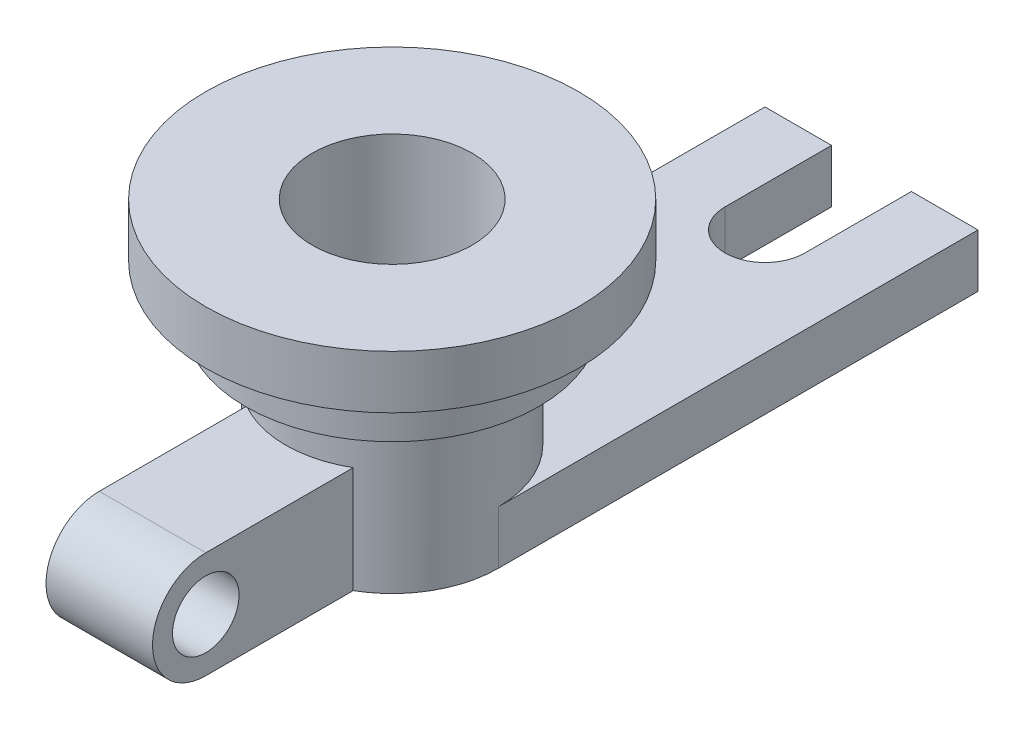
ISO-10303-21;
HEADER;
FILE_DESCRIPTION(('STEP AP214'),'2;1');
FILE_NAME('part.step','',(''),(''),'','','');
FILE_SCHEMA(('AUTOMOTIVE_DESIGN { 1 0 10303 214 1 1 1 1 }'));
ENDSEC;
DATA;
#1=APPLICATION_CONTEXT('core data for automotive mechanical design processes');
#2=APPLICATION_PROTOCOL_DEFINITION('international standard','automotive_design',2000,#1);
#3=PRODUCT_CONTEXT('',#1,'mechanical');
#4=PRODUCT('Part','Part','',(#3));
#5=PRODUCT_RELATED_PRODUCT_CATEGORY('part','',(#4));
#6=PRODUCT_DEFINITION_FORMATION('','',#4);
#7=PRODUCT_DEFINITION_CONTEXT('part definition',#1,'design');
#8=PRODUCT_DEFINITION('design','',#6,#7);
#9=PRODUCT_DEFINITION_SHAPE('','',#8);
#10=(LENGTH_UNIT() NAMED_UNIT(*) SI_UNIT(.MILLI.,.METRE.));
#11=(NAMED_UNIT(*) PLANE_ANGLE_UNIT() SI_UNIT($,.RADIAN.));
#12=(NAMED_UNIT(*) SI_UNIT($,.STERADIAN.) SOLID_ANGLE_UNIT());
#13=UNCERTAINTY_MEASURE_WITH_UNIT(LENGTH_MEASURE(1.E-05),#10,'distance_accuracy_value','');
#14=(GEOMETRIC_REPRESENTATION_CONTEXT(3) GLOBAL_UNCERTAINTY_ASSIGNED_CONTEXT((#13)) GLOBAL_UNIT_ASSIGNED_CONTEXT((#10,
#11,#12)) REPRESENTATION_CONTEXT('',''));
#15=CARTESIAN_POINT('',(0.,0.,0.));
#16=DIRECTION('',(0.,0.,1.));
#17=DIRECTION('',(1.,0.,0.));
#18=AXIS2_PLACEMENT_3D('',#15,#16,#17);
#19=CARTESIAN_POINT('',(-40.,0.,0.));
#20=DIRECTION('',(0.,1.,0.));
#21=DIRECTION('',(0.,0.,1.));
#22=AXIS2_PLACEMENT_3D('',#19,#20,#21);
#23=PLANE('',#22);
#24=DIRECTION('',(0.,0.,1.));
#25=VECTOR('',#24,1.);
#26=CARTESIAN_POINT('',(-20.,0.,90.));
#27=LINE('',#26,#25);
#28=CARTESIAN_POINT('',(-20.,0.,34.6410161513775));
#29=VERTEX_POINT('',#28);
#30=CARTESIAN_POINT('',(-20.,0.,90.));
#31=VERTEX_POINT('',#30);
#32=EDGE_CURVE('E118',#29,#31,#27,.T.);
#33=ORIENTED_EDGE('',*,*,#32,.F.);
#34=CARTESIAN_POINT('',(0.,0.,0.));
#35=DIRECTION('',(0.,-1.,0.));
#36=DIRECTION('',(0.,0.,-1.));
#37=AXIS2_PLACEMENT_3D('',#34,#35,#36);
#38=CIRCLE('',#37,40.);
#39=CARTESIAN_POINT('',(-40.,0.,0.));
#40=VERTEX_POINT('',#39);
#41=EDGE_CURVE('E52',#29,#40,#38,.T.);
#42=ORIENTED_EDGE('',*,*,#41,.T.);
#43=DIRECTION('',(0.,0.,1.));
#44=VECTOR('',#43,1.);
#45=CARTESIAN_POINT('',(-40.,0.,-180.));
#46=LINE('',#45,#44);
#47=CARTESIAN_POINT('',(-40.,0.,-180.));
#48=VERTEX_POINT('',#47);
#49=EDGE_CURVE('E172',#48,#40,#46,.T.);
#50=ORIENTED_EDGE('',*,*,#49,.F.);
#51=DIRECTION('',(-1.,0.,0.));
#52=VECTOR('',#51,1.);
#53=CARTESIAN_POINT('',(-15.0000000000001,0.,-180.));
#54=LINE('',#53,#52);
#55=CARTESIAN_POINT('',(-15.0000000000001,0.,-180.));
#56=VERTEX_POINT('',#55);
#57=EDGE_CURVE('E170',#56,#48,#54,.T.);
#58=ORIENTED_EDGE('',*,*,#57,.F.);
#59=DIRECTION('',(0.,0.,-1.));
#60=VECTOR('',#59,1.);
#61=CARTESIAN_POINT('',(-15.,0.,-140.));
#62=LINE('',#61,#60);
#63=CARTESIAN_POINT('',(-15.,0.,-140.));
#64=VERTEX_POINT('',#63);
#65=EDGE_CURVE('E145',#64,#56,#62,.T.);
#66=ORIENTED_EDGE('',*,*,#65,.F.);
#67=CARTESIAN_POINT('',(0.,0.,-140.));
#68=DIRECTION('',(0.,-1.,0.));
#69=DIRECTION('',(0.,0.,1.));
#70=AXIS2_PLACEMENT_3D('',#67,#68,#69);
#71=CIRCLE('',#70,15.);
#72=CARTESIAN_POINT('',(14.9999999999999,0.,-140.));
#73=VERTEX_POINT('',#72);
#74=EDGE_CURVE('E142',#73,#64,#71,.T.);
#75=ORIENTED_EDGE('',*,*,#74,.F.);
#76=DIRECTION('',(0.,0.,1.));
#77=VECTOR('',#76,1.);
#78=CARTESIAN_POINT('',(14.9999999999999,0.,-140.));
#79=LINE('',#78,#77);
#80=CARTESIAN_POINT('',(15.,0.,-180.));
#81=VERTEX_POINT('',#80);
#82=EDGE_CURVE('E154',#81,#73,#79,.T.);
#83=ORIENTED_EDGE('',*,*,#82,.F.);
#84=DIRECTION('',(-1.,0.,0.));
#85=VECTOR('',#84,1.);
#86=CARTESIAN_POINT('',(15.,0.,-180.));
#87=LINE('',#86,#85);
#88=CARTESIAN_POINT('',(39.9999999999999,0.,-180.));
#89=VERTEX_POINT('',#88);
#90=EDGE_CURVE('E177',#89,#81,#87,.T.);
#91=ORIENTED_EDGE('',*,*,#90,.F.);
#92=DIRECTION('',(0.,0.,-1.));
#93=VECTOR('',#92,1.);
#94=CARTESIAN_POINT('',(39.9999999999999,0.,-180.));
#95=LINE('',#94,#93);
#96=CARTESIAN_POINT('',(40.,0.,0.));
#97=VERTEX_POINT('',#96);
#98=EDGE_CURVE('E175',#97,#89,#95,.T.);
#99=ORIENTED_EDGE('',*,*,#98,.F.);
#100=CARTESIAN_POINT('',(20.,0.,34.6410161513775));
#101=VERTEX_POINT('',#100);
#102=EDGE_CURVE('E202',#97,#101,#38,.T.);
#103=ORIENTED_EDGE('',*,*,#102,.T.);
#104=DIRECTION('',(0.,0.,1.));
#105=VECTOR('',#104,1.);
#106=CARTESIAN_POINT('',(20.,0.,90.));
#107=LINE('',#106,#105);
#108=CARTESIAN_POINT('',(20.,0.,90.));
#109=VERTEX_POINT('',#108);
#110=EDGE_CURVE('E140',#101,#109,#107,.T.);
#111=ORIENTED_EDGE('',*,*,#110,.T.);
#112=DIRECTION('',(1.,0.,0.));
#113=VECTOR('',#112,1.);
#114=CARTESIAN_POINT('',(-20.,0.,90.));
#115=LINE('',#114,#113);
#116=EDGE_CURVE('E131',#31,#109,#115,.T.);
#117=ORIENTED_EDGE('',*,*,#116,.F.);
#118=EDGE_LOOP('',(#33,#42,#50,#58,#66,#75,#83,#91,#99,#103,#111,#117));
#119=FACE_BOUND('',#118,.T.);
#120=CARTESIAN_POINT('',(0.,0.,0.));
#121=DIRECTION('',(0.,-1.,0.));
#122=DIRECTION('',(0.,0.,-1.));
#123=AXIS2_PLACEMENT_3D('',#120,#121,#122);
#124=CIRCLE('',#123,30.);
#125=CARTESIAN_POINT('',(0.,0.,-30.));
#126=VERTEX_POINT('',#125);
#127=EDGE_CURVE('E222',#126,#126,#124,.T.);
#128=ORIENTED_EDGE('',*,*,#127,.F.);
#129=EDGE_LOOP('',(#128));
#130=FACE_BOUND('',#129,.T.);
#131=ADVANCED_FACE('F33',(#119,#130),#23,.F.);
#132=CARTESIAN_POINT('',(0.,0.,0.));
#133=DIRECTION('',(0.,-1.,0.));
#134=DIRECTION('',(0.,0.,-1.));
#135=AXIS2_PLACEMENT_3D('',#132,#133,#134);
#136=CYLINDRICAL_SURFACE('',#135,30.);
#137=CARTESIAN_POINT('',(0.,100.,0.));
#138=DIRECTION('',(0.,-1.,0.));
#139=DIRECTION('',(0.,0.,-1.));
#140=AXIS2_PLACEMENT_3D('',#137,#138,#139);
#141=CIRCLE('',#140,30.);
#142=CARTESIAN_POINT('',(0.,100.,-30.));
#143=VERTEX_POINT('',#142);
#144=EDGE_CURVE('E219',#143,#143,#141,.T.);
#145=ORIENTED_EDGE('',*,*,#144,.F.);
#146=EDGE_LOOP('',(#145));
#147=FACE_BOUND('',#146,.T.);
#148=ORIENTED_EDGE('',*,*,#127,.T.);
#149=EDGE_LOOP('',(#148));
#150=FACE_BOUND('',#149,.T.);
#151=ADVANCED_FACE('F261',(#147,#150),#136,.F.);
#152=CARTESIAN_POINT('',(-30.,100.,0.));
#153=DIRECTION('',(0.,-1.,0.));
#154=DIRECTION('',(0.,0.,-1.));
#155=AXIS2_PLACEMENT_3D('',#152,#153,#154);
#156=PLANE('',#155);
#157=CARTESIAN_POINT('',(0.,100.,0.));
#158=DIRECTION('',(0.,-1.,0.));
#159=DIRECTION('',(0.,0.,-1.));
#160=AXIS2_PLACEMENT_3D('',#157,#158,#159);
#161=CIRCLE('',#160,70.);
#162=CARTESIAN_POINT('',(0.,100.,-70.));
#163=VERTEX_POINT('',#162);
#164=EDGE_CURVE('E216',#163,#163,#161,.T.);
#165=ORIENTED_EDGE('',*,*,#164,.F.);
#166=EDGE_LOOP('',(#165));
#167=FACE_BOUND('',#166,.T.);
#168=ORIENTED_EDGE('',*,*,#144,.T.);
#169=EDGE_LOOP('',(#168));
#170=FACE_BOUND('',#169,.T.);
#171=ADVANCED_FACE('F265',(#167,#170),#156,.F.);
#172=CARTESIAN_POINT('',(0.,0.,0.));
#173=DIRECTION('',(0.,-1.,0.));
#174=DIRECTION('',(0.,0.,-1.));
#175=AXIS2_PLACEMENT_3D('',#172,#173,#174);
#176=CYLINDRICAL_SURFACE('',#175,70.);
#177=CARTESIAN_POINT('',(0.,80.,0.));
#178=DIRECTION('',(0.,-1.,0.));
#179=DIRECTION('',(0.,0.,-1.));
#180=AXIS2_PLACEMENT_3D('',#177,#178,#179);
#181=CIRCLE('',#180,70.);
#182=CARTESIAN_POINT('',(0.,80.,-70.));
#183=VERTEX_POINT('',#182);
#184=EDGE_CURVE('E213',#183,#183,#181,.T.);
#185=ORIENTED_EDGE('',*,*,#184,.F.);
#186=EDGE_LOOP('',(#185));
#187=FACE_BOUND('',#186,.T.);
#188=ORIENTED_EDGE('',*,*,#164,.T.);
#189=EDGE_LOOP('',(#188));
#190=FACE_BOUND('',#189,.T.);
#191=ADVANCED_FACE('F270',(#187,#190),#176,.T.);
#192=CARTESIAN_POINT('',(-70.,80.,0.));
#193=DIRECTION('',(0.,1.,0.));
#194=DIRECTION('',(0.,0.,1.));
#195=AXIS2_PLACEMENT_3D('',#192,#193,#194);
#196=PLANE('',#195);
#197=CARTESIAN_POINT('',(0.,80.,0.));
#198=DIRECTION('',(0.,-1.,0.));
#199=DIRECTION('',(0.,0.,-1.));
#200=AXIS2_PLACEMENT_3D('',#197,#198,#199);
#201=CIRCLE('',#200,55.);
#202=CARTESIAN_POINT('',(0.,80.,-55.));
#203=VERTEX_POINT('',#202);
#204=EDGE_CURVE('E210',#203,#203,#201,.T.);
#205=ORIENTED_EDGE('',*,*,#204,.F.);
#206=EDGE_LOOP('',(#205));
#207=FACE_BOUND('',#206,.T.);
#208=ORIENTED_EDGE('',*,*,#184,.T.);
#209=EDGE_LOOP('',(#208));
#210=FACE_BOUND('',#209,.T.);
#211=ADVANCED_FACE('F278',(#207,#210),#196,.F.);
#212=CARTESIAN_POINT('',(0.,0.,0.));
#213=DIRECTION('',(0.,-1.,0.));
#214=DIRECTION('',(0.,0.,-1.));
#215=AXIS2_PLACEMENT_3D('',#212,#213,#214);
#216=CYLINDRICAL_SURFACE('',#215,55.);
#217=CARTESIAN_POINT('',(0.,60.,0.));
#218=DIRECTION('',(0.,-1.,0.));
#219=DIRECTION('',(0.,0.,-1.));
#220=AXIS2_PLACEMENT_3D('',#217,#218,#219);
#221=CIRCLE('',#220,55.);
#222=CARTESIAN_POINT('',(0.,60.,-55.));
#223=VERTEX_POINT('',#222);
#224=EDGE_CURVE('E207',#223,#223,#221,.T.);
#225=ORIENTED_EDGE('',*,*,#224,.F.);
#226=EDGE_LOOP('',(#225));
#227=FACE_BOUND('',#226,.T.);
#228=ORIENTED_EDGE('',*,*,#204,.T.);
#229=EDGE_LOOP('',(#228));
#230=FACE_BOUND('',#229,.T.);
#231=ADVANCED_FACE('F282',(#227,#230),#216,.T.);
#232=CARTESIAN_POINT('',(-55.,60.,0.));
#233=DIRECTION('',(0.,1.,0.));
#234=DIRECTION('',(0.,0.,1.));
#235=AXIS2_PLACEMENT_3D('',#232,#233,#234);
#236=PLANE('',#235);
#237=CARTESIAN_POINT('',(0.,60.,0.));
#238=DIRECTION('',(0.,-1.,0.));
#239=DIRECTION('',(0.,0.,-1.));
#240=AXIS2_PLACEMENT_3D('',#237,#238,#239);
#241=CIRCLE('',#240,40.);
#242=CARTESIAN_POINT('',(0.,60.,-40.));
#243=VERTEX_POINT('',#242);
#244=EDGE_CURVE('E204',#243,#243,#241,.T.);
#245=ORIENTED_EDGE('',*,*,#244,.F.);
#246=EDGE_LOOP('',(#245));
#247=FACE_BOUND('',#246,.T.);
#248=ORIENTED_EDGE('',*,*,#224,.T.);
#249=EDGE_LOOP('',(#248));
#250=FACE_BOUND('',#249,.T.);
#251=ADVANCED_FACE('F286',(#247,#250),#236,.F.);
#252=CARTESIAN_POINT('',(0.,0.,0.));
#253=DIRECTION('',(0.,-1.,0.));
#254=DIRECTION('',(0.,0.,-1.));
#255=AXIS2_PLACEMENT_3D('',#252,#253,#254);
#256=CYLINDRICAL_SURFACE('',#255,40.);
#257=ORIENTED_EDGE('',*,*,#41,.F.);
#258=DIRECTION('',(0.,-1.,0.));
#259=VECTOR('',#258,1.);
#260=CARTESIAN_POINT('',(-20.,0.,34.6410161513775));
#261=LINE('',#260,#259);
#262=CARTESIAN_POINT('',(-20.,40.,34.6410161513775));
#263=VERTEX_POINT('',#262);
#264=EDGE_CURVE('E11',#29,#263,#261,.F.);
#265=ORIENTED_EDGE('',*,*,#264,.T.);
#266=CARTESIAN_POINT('',(0.,40.,0.));
#267=DIRECTION('',(0.,-1.,0.));
#268=DIRECTION('',(0.,0.,-1.));
#269=AXIS2_PLACEMENT_3D('',#266,#267,#268);
#270=CIRCLE('',#269,40.);
#271=CARTESIAN_POINT('',(20.,40.,34.6410161513775));
#272=VERTEX_POINT('',#271);
#273=EDGE_CURVE('E46',#272,#263,#270,.T.);
#274=ORIENTED_EDGE('',*,*,#273,.F.);
#275=DIRECTION('',(0.,-1.,0.));
#276=VECTOR('',#275,1.);
#277=CARTESIAN_POINT('',(20.,0.,34.6410161513775));
#278=LINE('',#277,#276);
#279=EDGE_CURVE('E40',#101,#272,#278,.F.);
#280=ORIENTED_EDGE('',*,*,#279,.F.);
#281=ORIENTED_EDGE('',*,*,#102,.F.);
#282=DIRECTION('',(0.,-1.,0.));
#283=VECTOR('',#282,1.);
#284=CARTESIAN_POINT('',(40.,20.,0.));
#285=LINE('',#284,#283);
#286=CARTESIAN_POINT('',(40.,20.,0.));
#287=VERTEX_POINT('',#286);
#288=EDGE_CURVE('E188',#287,#97,#285,.T.);
#289=ORIENTED_EDGE('',*,*,#288,.F.);
#290=CARTESIAN_POINT('',(0.,20.,0.));
#291=DIRECTION('',(0.,-1.,0.));
#292=DIRECTION('',(0.,0.,1.));
#293=AXIS2_PLACEMENT_3D('',#290,#291,#292);
#294=CIRCLE('',#293,40.);
#295=CARTESIAN_POINT('',(-40.,20.,0.));
#296=VERTEX_POINT('',#295);
#297=EDGE_CURVE('E160',#296,#287,#294,.T.);
#298=ORIENTED_EDGE('',*,*,#297,.F.);
#299=DIRECTION('',(0.,-1.,0.));
#300=VECTOR('',#299,1.);
#301=CARTESIAN_POINT('',(-40.,20.,0.));
#302=LINE('',#301,#300);
#303=EDGE_CURVE('E191',#296,#40,#302,.T.);
#304=ORIENTED_EDGE('',*,*,#303,.T.);
#305=EDGE_LOOP('',(#257,#265,#274,#280,#281,#289,#298,#304));
#306=FACE_BOUND('',#305,.T.);
#307=ORIENTED_EDGE('',*,*,#244,.T.);
#308=EDGE_LOOP('',(#307));
#309=FACE_BOUND('',#308,.T.);
#310=ADVANCED_FACE('F290',(#306,#309),#256,.T.);
#311=CARTESIAN_POINT('',(0.,20.,-140.));
#312=DIRECTION('',(0.,-1.,0.));
#313=DIRECTION('',(0.,0.,-1.));
#314=AXIS2_PLACEMENT_3D('',#311,#312,#313);
#315=CYLINDRICAL_SURFACE('',#314,15.);
#316=ORIENTED_EDGE('',*,*,#74,.T.);
#317=DIRECTION('',(0.,-1.,0.));
#318=VECTOR('',#317,1.);
#319=CARTESIAN_POINT('',(-15.,20.,-140.));
#320=LINE('',#319,#318);
#321=CARTESIAN_POINT('',(-15.,20.,-140.));
#322=VERTEX_POINT('',#321);
#323=EDGE_CURVE('E199',#322,#64,#320,.T.);
#324=ORIENTED_EDGE('',*,*,#323,.F.);
#325=CARTESIAN_POINT('',(0.,20.,-140.));
#326=DIRECTION('',(0.,-1.,0.));
#327=DIRECTION('',(0.,0.,1.));
#328=AXIS2_PLACEMENT_3D('',#325,#326,#327);
#329=CIRCLE('',#328,15.);
#330=CARTESIAN_POINT('',(14.9999999999999,20.,-140.));
#331=VERTEX_POINT('',#330);
#332=EDGE_CURVE('E150',#331,#322,#329,.T.);
#333=ORIENTED_EDGE('',*,*,#332,.F.);
#334=DIRECTION('',(0.,-1.,0.));
#335=VECTOR('',#334,1.);
#336=CARTESIAN_POINT('',(14.9999999999999,20.,-140.));
#337=LINE('',#336,#335);
#338=EDGE_CURVE('E167',#331,#73,#337,.T.);
#339=ORIENTED_EDGE('',*,*,#338,.T.);
#340=EDGE_LOOP('',(#316,#324,#333,#339));
#341=FACE_BOUND('',#340,.T.);
#342=ADVANCED_FACE('F294',(#341),#315,.F.);
#343=CARTESIAN_POINT('',(-15.,20.,-140.));
#344=DIRECTION('',(-1.,0.,0.));
#345=DIRECTION('',(0.,0.,1.));
#346=AXIS2_PLACEMENT_3D('',#343,#344,#345);
#347=PLANE('',#346);
#348=ORIENTED_EDGE('',*,*,#65,.T.);
#349=DIRECTION('',(0.,-1.,0.));
#350=VECTOR('',#349,1.);
#351=CARTESIAN_POINT('',(-15.0000000000001,20.,-180.));
#352=LINE('',#351,#350);
#353=CARTESIAN_POINT('',(-15.0000000000001,20.,-180.));
#354=VERTEX_POINT('',#353);
#355=EDGE_CURVE('E196',#354,#56,#352,.T.);
#356=ORIENTED_EDGE('',*,*,#355,.F.);
#357=DIRECTION('',(0.,0.,-1.));
#358=VECTOR('',#357,1.);
#359=CARTESIAN_POINT('',(-15.,20.,-140.));
#360=LINE('',#359,#358);
#361=EDGE_CURVE('E153',#322,#354,#360,.T.);
#362=ORIENTED_EDGE('',*,*,#361,.F.);
#363=ORIENTED_EDGE('',*,*,#323,.T.);
#364=EDGE_LOOP('',(#348,#356,#362,#363));
#365=FACE_BOUND('',#364,.T.);
#366=ADVANCED_FACE('F297',(#365),#347,.F.);
#367=CARTESIAN_POINT('',(-15.0000000000001,20.,-180.));
#368=DIRECTION('',(0.,0.,1.));
#369=DIRECTION('',(1.,0.,0.));
#370=AXIS2_PLACEMENT_3D('',#367,#368,#369);
#371=PLANE('',#370);
#372=ORIENTED_EDGE('',*,*,#57,.T.);
#373=DIRECTION('',(0.,-1.,0.));
#374=VECTOR('',#373,1.);
#375=CARTESIAN_POINT('',(-40.,20.,-180.));
#376=LINE('',#375,#374);
#377=CARTESIAN_POINT('',(-40.,20.,-180.));
#378=VERTEX_POINT('',#377);
#379=EDGE_CURVE('E193',#378,#48,#376,.T.);
#380=ORIENTED_EDGE('',*,*,#379,.F.);
#381=DIRECTION('',(-1.,0.,0.));
#382=VECTOR('',#381,1.);
#383=CARTESIAN_POINT('',(-15.0000000000001,20.,-180.));
#384=LINE('',#383,#382);
#385=EDGE_CURVE('E156',#354,#378,#384,.T.);
#386=ORIENTED_EDGE('',*,*,#385,.F.);
#387=ORIENTED_EDGE('',*,*,#355,.T.);
#388=EDGE_LOOP('',(#372,#380,#386,#387));
#389=FACE_BOUND('',#388,.T.);
#390=ADVANCED_FACE('F301',(#389),#371,.F.);
#391=CARTESIAN_POINT('',(-40.,20.,-180.));
#392=DIRECTION('',(1.,0.,0.));
#393=DIRECTION('',(0.,0.,-1.));
#394=AXIS2_PLACEMENT_3D('',#391,#392,#393);
#395=PLANE('',#394);
#396=ORIENTED_EDGE('',*,*,#49,.T.);
#397=ORIENTED_EDGE('',*,*,#303,.F.);
#398=DIRECTION('',(0.,0.,1.));
#399=VECTOR('',#398,1.);
#400=CARTESIAN_POINT('',(-40.,20.,-180.));
#401=LINE('',#400,#399);
#402=EDGE_CURVE('E158',#378,#296,#401,.T.);
#403=ORIENTED_EDGE('',*,*,#402,.F.);
#404=ORIENTED_EDGE('',*,*,#379,.T.);
#405=EDGE_LOOP('',(#396,#397,#403,#404));
#406=FACE_BOUND('',#405,.T.);
#407=ADVANCED_FACE('F305',(#406),#395,.F.);
#408=CARTESIAN_POINT('',(39.9999999999999,20.,-180.));
#409=DIRECTION('',(-1.,0.,0.));
#410=DIRECTION('',(0.,0.,1.));
#411=AXIS2_PLACEMENT_3D('',#408,#409,#410);
#412=PLANE('',#411);
#413=ORIENTED_EDGE('',*,*,#98,.T.);
#414=DIRECTION('',(0.,-1.,0.));
#415=VECTOR('',#414,1.);
#416=CARTESIAN_POINT('',(39.9999999999999,20.,-180.));
#417=LINE('',#416,#415);
#418=CARTESIAN_POINT('',(39.9999999999999,20.,-180.));
#419=VERTEX_POINT('',#418);
#420=EDGE_CURVE('E185',#419,#89,#417,.T.);
#421=ORIENTED_EDGE('',*,*,#420,.F.);
#422=DIRECTION('',(0.,0.,-1.));
#423=VECTOR('',#422,1.);
#424=CARTESIAN_POINT('',(39.9999999999999,20.,-180.));
#425=LINE('',#424,#423);
#426=EDGE_CURVE('E162',#287,#419,#425,.T.);
#427=ORIENTED_EDGE('',*,*,#426,.F.);
#428=ORIENTED_EDGE('',*,*,#288,.T.);
#429=EDGE_LOOP('',(#413,#421,#427,#428));
#430=FACE_BOUND('',#429,.T.);
#431=ADVANCED_FACE('F309',(#430),#412,.F.);
#432=CARTESIAN_POINT('',(15.,20.,-180.));
#433=DIRECTION('',(0.,0.,1.));
#434=DIRECTION('',(1.,0.,0.));
#435=AXIS2_PLACEMENT_3D('',#432,#433,#434);
#436=PLANE('',#435);
#437=ORIENTED_EDGE('',*,*,#90,.T.);
#438=DIRECTION('',(0.,-1.,0.));
#439=VECTOR('',#438,1.);
#440=CARTESIAN_POINT('',(15.,20.,-180.));
#441=LINE('',#440,#439);
#442=CARTESIAN_POINT('',(15.,20.,-180.));
#443=VERTEX_POINT('',#442);
#444=EDGE_CURVE('E182',#443,#81,#441,.T.);
#445=ORIENTED_EDGE('',*,*,#444,.F.);
#446=DIRECTION('',(-1.,0.,0.));
#447=VECTOR('',#446,1.);
#448=CARTESIAN_POINT('',(15.,20.,-180.));
#449=LINE('',#448,#447);
#450=EDGE_CURVE('E164',#419,#443,#449,.T.);
#451=ORIENTED_EDGE('',*,*,#450,.F.);
#452=ORIENTED_EDGE('',*,*,#420,.T.);
#453=EDGE_LOOP('',(#437,#445,#451,#452));
#454=FACE_BOUND('',#453,.T.);
#455=ADVANCED_FACE('F313',(#454),#436,.F.);
#456=CARTESIAN_POINT('',(14.9999999999999,20.,-140.));
#457=DIRECTION('',(1.,0.,0.));
#458=DIRECTION('',(0.,0.,-1.));
#459=AXIS2_PLACEMENT_3D('',#456,#457,#458);
#460=PLANE('',#459);
#461=ORIENTED_EDGE('',*,*,#82,.T.);
#462=ORIENTED_EDGE('',*,*,#338,.F.);
#463=DIRECTION('',(0.,0.,1.));
#464=VECTOR('',#463,1.);
#465=CARTESIAN_POINT('',(14.9999999999999,20.,-140.));
#466=LINE('',#465,#464);
#467=EDGE_CURVE('E166',#443,#331,#466,.T.);
#468=ORIENTED_EDGE('',*,*,#467,.F.);
#469=ORIENTED_EDGE('',*,*,#444,.T.);
#470=EDGE_LOOP('',(#461,#462,#468,#469));
#471=FACE_BOUND('',#470,.T.);
#472=ADVANCED_FACE('F256',(#471),#460,.F.);
#473=CARTESIAN_POINT('',(0.,20.,-140.));
#474=DIRECTION('',(0.,1.,0.));
#475=DIRECTION('',(0.,0.,1.));
#476=AXIS2_PLACEMENT_3D('',#473,#474,#475);
#477=PLANE('',#476);
#478=ORIENTED_EDGE('',*,*,#332,.T.);
#479=ORIENTED_EDGE('',*,*,#361,.T.);
#480=ORIENTED_EDGE('',*,*,#385,.T.);
#481=ORIENTED_EDGE('',*,*,#402,.T.);
#482=ORIENTED_EDGE('',*,*,#297,.T.);
#483=ORIENTED_EDGE('',*,*,#426,.T.);
#484=ORIENTED_EDGE('',*,*,#450,.T.);
#485=ORIENTED_EDGE('',*,*,#467,.T.);
#486=EDGE_LOOP('',(#478,#479,#480,#481,#482,#483,#484,#485));
#487=FACE_BOUND('',#486,.T.);
#488=ADVANCED_FACE('F248',(#487),#477,.T.);
#489=CARTESIAN_POINT('',(-20.,20.,90.));
#490=DIRECTION('',(-1.,0.,0.));
#491=DIRECTION('',(0.,0.,1.));
#492=AXIS2_PLACEMENT_3D('',#489,#490,#491);
#493=PLANE('',#492);
#494=CARTESIAN_POINT('',(-20.,20.,90.));
#495=DIRECTION('',(-1.,0.,0.));
#496=DIRECTION('',(0.,0.,1.));
#497=AXIS2_PLACEMENT_3D('',#494,#495,#496);
#498=CIRCLE('',#497,12.5);
#499=CARTESIAN_POINT('',(-20.,20.,102.5));
#500=VERTEX_POINT('',#499);
#501=EDGE_CURVE('E236',#500,#500,#498,.T.);
#502=ORIENTED_EDGE('',*,*,#501,.F.);
#503=EDGE_LOOP('',(#502));
#504=FACE_BOUND('',#503,.T.);
#505=ORIENTED_EDGE('',*,*,#264,.F.);
#506=ORIENTED_EDGE('',*,*,#32,.T.);
#507=CARTESIAN_POINT('',(-20.,20.,90.));
#508=DIRECTION('',(-1.,0.,0.));
#509=DIRECTION('',(0.,0.,1.));
#510=AXIS2_PLACEMENT_3D('',#507,#508,#509);
#511=CIRCLE('',#510,20.);
#512=CARTESIAN_POINT('',(-20.,40.,90.));
#513=VERTEX_POINT('',#512);
#514=EDGE_CURVE('E122',#31,#513,#511,.T.);
#515=ORIENTED_EDGE('',*,*,#514,.T.);
#516=DIRECTION('',(0.,0.,-1.));
#517=VECTOR('',#516,1.);
#518=CARTESIAN_POINT('',(-20.,40.,30.));
#519=LINE('',#518,#517);
#520=EDGE_CURVE('E135',#513,#263,#519,.T.);
#521=ORIENTED_EDGE('',*,*,#520,.T.);
#522=EDGE_LOOP('',(#505,#506,#515,#521));
#523=FACE_BOUND('',#522,.T.);
#524=ADVANCED_FACE('F120',(#504,#523),#493,.T.);
#525=CARTESIAN_POINT('',(20.,20.,90.));
#526=DIRECTION('',(-1.,0.,0.));
#527=DIRECTION('',(0.,0.,1.));
#528=AXIS2_PLACEMENT_3D('',#525,#526,#527);
#529=PLANE('',#528);
#530=CARTESIAN_POINT('',(20.,20.,90.));
#531=DIRECTION('',(-1.,0.,0.));
#532=DIRECTION('',(0.,0.,1.));
#533=AXIS2_PLACEMENT_3D('',#530,#531,#532);
#534=CIRCLE('',#533,12.5);
#535=CARTESIAN_POINT('',(20.,20.,102.5));
#536=VERTEX_POINT('',#535);
#537=EDGE_CURVE('E238',#536,#536,#534,.T.);
#538=ORIENTED_EDGE('',*,*,#537,.T.);
#539=EDGE_LOOP('',(#538));
#540=FACE_BOUND('',#539,.T.);
#541=ORIENTED_EDGE('',*,*,#110,.F.);
#542=ORIENTED_EDGE('',*,*,#279,.T.);
#543=DIRECTION('',(0.,0.,-1.));
#544=VECTOR('',#543,1.);
#545=CARTESIAN_POINT('',(20.,40.,30.));
#546=LINE('',#545,#544);
#547=CARTESIAN_POINT('',(20.,40.,90.));
#548=VERTEX_POINT('',#547);
#549=EDGE_CURVE('E126',#548,#272,#546,.T.);
#550=ORIENTED_EDGE('',*,*,#549,.F.);
#551=CARTESIAN_POINT('',(20.,20.,90.));
#552=DIRECTION('',(-1.,0.,0.));
#553=DIRECTION('',(0.,0.,1.));
#554=AXIS2_PLACEMENT_3D('',#551,#552,#553);
#555=CIRCLE('',#554,20.);
#556=EDGE_CURVE('E232',#109,#548,#555,.T.);
#557=ORIENTED_EDGE('',*,*,#556,.F.);
#558=EDGE_LOOP('',(#541,#542,#550,#557));
#559=FACE_BOUND('',#558,.T.);
#560=ADVANCED_FACE('F228',(#540,#559),#529,.F.);
#561=CARTESIAN_POINT('',(-20.,20.,90.));
#562=DIRECTION('',(1.,0.,0.));
#563=DIRECTION('',(0.,0.,-1.));
#564=AXIS2_PLACEMENT_3D('',#561,#562,#563);
#565=CYLINDRICAL_SURFACE('',#564,20.);
#566=ORIENTED_EDGE('',*,*,#556,.T.);
#567=DIRECTION('',(1.,0.,0.));
#568=VECTOR('',#567,1.);
#569=CARTESIAN_POINT('',(-20.,40.,90.));
#570=LINE('',#569,#568);
#571=EDGE_CURVE('E133',#513,#548,#570,.T.);
#572=ORIENTED_EDGE('',*,*,#571,.F.);
#573=ORIENTED_EDGE('',*,*,#514,.F.);
#574=ORIENTED_EDGE('',*,*,#116,.T.);
#575=EDGE_LOOP('',(#566,#572,#573,#574));
#576=FACE_BOUND('',#575,.T.);
#577=ADVANCED_FACE('F130',(#576),#565,.T.);
#578=CARTESIAN_POINT('',(-20.,40.,30.));
#579=DIRECTION('',(0.,-1.,0.));
#580=DIRECTION('',(0.,0.,-1.));
#581=AXIS2_PLACEMENT_3D('',#578,#579,#580);
#582=PLANE('',#581);
#583=ORIENTED_EDGE('',*,*,#549,.T.);
#584=ORIENTED_EDGE('',*,*,#273,.T.);
#585=ORIENTED_EDGE('',*,*,#520,.F.);
#586=ORIENTED_EDGE('',*,*,#571,.T.);
#587=EDGE_LOOP('',(#583,#584,#585,#586));
#588=FACE_BOUND('',#587,.T.);
#589=ADVANCED_FACE('F231',(#588),#582,.F.);
#590=CARTESIAN_POINT('',(-20.,20.,90.));
#591=DIRECTION('',(1.,0.,0.));
#592=DIRECTION('',(0.,0.,-1.));
#593=AXIS2_PLACEMENT_3D('',#590,#591,#592);
#594=CYLINDRICAL_SURFACE('',#593,12.5);
#595=ORIENTED_EDGE('',*,*,#501,.T.);
#596=EDGE_LOOP('',(#595));
#597=FACE_BOUND('',#596,.T.);
#598=ORIENTED_EDGE('',*,*,#537,.F.);
#599=EDGE_LOOP('',(#598));
#600=FACE_BOUND('',#599,.T.);
#601=ADVANCED_FACE('F244',(#597,#600),#594,.F.);
#602=CLOSED_SHELL('',(#131,#151,#171,#191,#211,#231,#251,#310,#342,#366,#390,#407,#431,#455,
#472,#488,#524,#560,#577,#589,#601));
#603=MANIFOLD_SOLID_BREP('B2',#602);
#604=ADVANCED_BREP_SHAPE_REPRESENTATION('',(#18,#603),#14);
#605=SHAPE_DEFINITION_REPRESENTATION(#9,#604);
ENDSEC;
END-ISO-10303-21;
